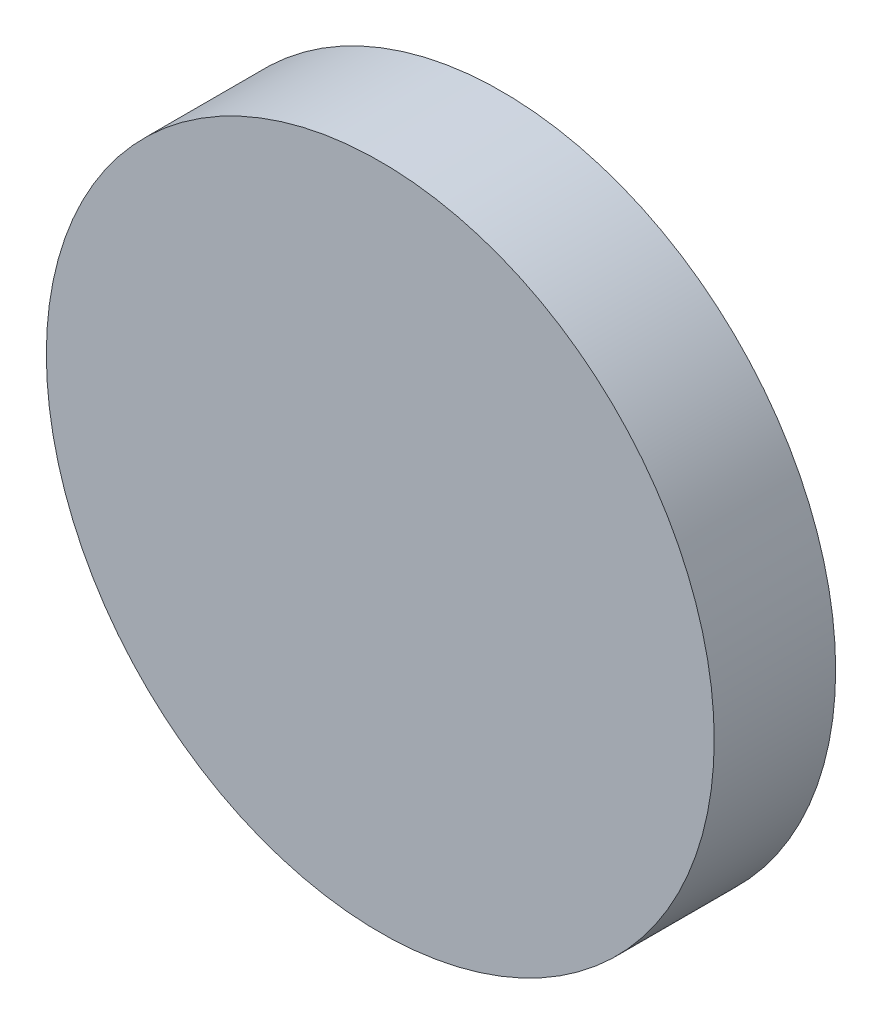
ISO-10303-21;
HEADER;
FILE_DESCRIPTION(('STEP AP214'),'2;1');
FILE_NAME('part.step','',(''),(''),'','','');
FILE_SCHEMA(('AUTOMOTIVE_DESIGN { 1 0 10303 214 1 1 1 1 }'));
ENDSEC;
DATA;
#1=APPLICATION_CONTEXT('core data for automotive mechanical design processes');
#2=APPLICATION_PROTOCOL_DEFINITION('international standard','automotive_design',2000,#1);
#3=PRODUCT_CONTEXT('',#1,'mechanical');
#4=PRODUCT('Part','Part','',(#3));
#5=PRODUCT_RELATED_PRODUCT_CATEGORY('part','',(#4));
#6=PRODUCT_DEFINITION_FORMATION('','',#4);
#7=PRODUCT_DEFINITION_CONTEXT('part definition',#1,'design');
#8=PRODUCT_DEFINITION('design','',#6,#7);
#9=PRODUCT_DEFINITION_SHAPE('','',#8);
#10=(LENGTH_UNIT() NAMED_UNIT(*) SI_UNIT(.MILLI.,.METRE.));
#11=(NAMED_UNIT(*) PLANE_ANGLE_UNIT() SI_UNIT($,.RADIAN.));
#12=(NAMED_UNIT(*) SI_UNIT($,.STERADIAN.) SOLID_ANGLE_UNIT());
#13=UNCERTAINTY_MEASURE_WITH_UNIT(LENGTH_MEASURE(1.E-05),#10,'distance_accuracy_value','');
#14=(GEOMETRIC_REPRESENTATION_CONTEXT(3) GLOBAL_UNCERTAINTY_ASSIGNED_CONTEXT((#13)) GLOBAL_UNIT_ASSIGNED_CONTEXT((#10,
#11,#12)) REPRESENTATION_CONTEXT('',''));
#15=CARTESIAN_POINT('',(0.,0.,0.));
#16=DIRECTION('',(0.,0.,1.));
#17=DIRECTION('',(1.,0.,0.));
#18=AXIS2_PLACEMENT_3D('',#15,#16,#17);
#19=CARTESIAN_POINT('',(0.,0.,76.2));
#20=DIRECTION('',(0.,0.,-1.));
#21=DIRECTION('',(-1.,0.,0.));
#22=AXIS2_PLACEMENT_3D('',#19,#20,#21);
#23=CYLINDRICAL_SURFACE('',#22,209.55);
#24=CARTESIAN_POINT('',(0.,0.,76.2));
#25=DIRECTION('',(0.,0.,1.));
#26=DIRECTION('',(1.,0.,0.));
#27=AXIS2_PLACEMENT_3D('',#24,#25,#26);
#28=CIRCLE('',#27,209.55);
#29=CARTESIAN_POINT('',(-209.55,0.,76.2));
#30=VERTEX_POINT('',#29);
#31=EDGE_CURVE('E10',#30,#30,#28,.T.);
#32=CARTESIAN_POINT('',(0.,0.,0.));
#33=DIRECTION('',(0.,0.,1.));
#34=DIRECTION('',(1.,0.,0.));
#35=AXIS2_PLACEMENT_3D('',#32,#33,#34);
#36=CIRCLE('',#35,209.55);
#37=CARTESIAN_POINT('',(-209.55,0.,0.));
#38=VERTEX_POINT('',#37);
#39=EDGE_CURVE('E34',#38,#38,#36,.T.);
#40=CARTESIAN_POINT('',(-209.55,0.,76.2));
#41=CARTESIAN_POINT('',(-209.55,0.,75.40625));
#42=CARTESIAN_POINT('',(-209.55,0.,74.6125));
#43=CARTESIAN_POINT('',(-209.55,0.,73.025));
#44=CARTESIAN_POINT('',(-209.55,0.,72.23125));
#45=CARTESIAN_POINT('',(-209.55,0.,70.64375));
#46=CARTESIAN_POINT('',(-209.55,0.,69.85));
#47=CARTESIAN_POINT('',(-209.55,0.,68.2625));
#48=CARTESIAN_POINT('',(-209.55,0.,67.46875));
#49=CARTESIAN_POINT('',(-209.55,0.,65.88125));
#50=CARTESIAN_POINT('',(-209.55,0.,65.0875));
#51=CARTESIAN_POINT('',(-209.55,0.,63.5));
#52=CARTESIAN_POINT('',(-209.55,0.,62.70625));
#53=CARTESIAN_POINT('',(-209.55,0.,61.11875));
#54=CARTESIAN_POINT('',(-209.55,0.,60.325));
#55=CARTESIAN_POINT('',(-209.55,0.,58.7375));
#56=CARTESIAN_POINT('',(-209.55,0.,57.94375));
#57=CARTESIAN_POINT('',(-209.55,0.,56.35625));
#58=CARTESIAN_POINT('',(-209.55,0.,55.5625));
#59=CARTESIAN_POINT('',(-209.55,0.,53.975));
#60=CARTESIAN_POINT('',(-209.55,0.,53.18125));
#61=CARTESIAN_POINT('',(-209.55,0.,51.59375));
#62=CARTESIAN_POINT('',(-209.55,0.,50.8));
#63=CARTESIAN_POINT('',(-209.55,0.,49.2125));
#64=CARTESIAN_POINT('',(-209.55,0.,48.41875));
#65=CARTESIAN_POINT('',(-209.55,0.,46.83125));
#66=CARTESIAN_POINT('',(-209.55,0.,46.0375));
#67=CARTESIAN_POINT('',(-209.55,0.,44.45));
#68=CARTESIAN_POINT('',(-209.55,0.,43.65625));
#69=CARTESIAN_POINT('',(-209.55,0.,42.06875));
#70=CARTESIAN_POINT('',(-209.55,0.,41.275));
#71=CARTESIAN_POINT('',(-209.55,0.,39.6875));
#72=CARTESIAN_POINT('',(-209.55,0.,38.89375));
#73=CARTESIAN_POINT('',(-209.55,0.,37.30625));
#74=CARTESIAN_POINT('',(-209.55,0.,36.5125));
#75=CARTESIAN_POINT('',(-209.55,0.,34.925));
#76=CARTESIAN_POINT('',(-209.55,0.,34.13125));
#77=CARTESIAN_POINT('',(-209.55,0.,32.54375));
#78=CARTESIAN_POINT('',(-209.55,0.,31.75));
#79=CARTESIAN_POINT('',(-209.55,0.,30.1625));
#80=CARTESIAN_POINT('',(-209.55,0.,29.36875));
#81=CARTESIAN_POINT('',(-209.55,0.,27.78125));
#82=CARTESIAN_POINT('',(-209.55,0.,26.9875));
#83=CARTESIAN_POINT('',(-209.55,0.,25.4));
#84=CARTESIAN_POINT('',(-209.55,0.,24.60625));
#85=CARTESIAN_POINT('',(-209.55,0.,23.01875));
#86=CARTESIAN_POINT('',(-209.55,0.,22.225));
#87=CARTESIAN_POINT('',(-209.55,0.,20.6375));
#88=CARTESIAN_POINT('',(-209.55,0.,19.84375));
#89=CARTESIAN_POINT('',(-209.55,0.,18.25625));
#90=CARTESIAN_POINT('',(-209.55,0.,17.4625));
#91=CARTESIAN_POINT('',(-209.55,0.,15.875));
#92=CARTESIAN_POINT('',(-209.55,0.,15.08125));
#93=CARTESIAN_POINT('',(-209.55,0.,13.49375));
#94=CARTESIAN_POINT('',(-209.55,0.,12.7));
#95=CARTESIAN_POINT('',(-209.55,0.,11.1125));
#96=CARTESIAN_POINT('',(-209.55,0.,10.31875));
#97=CARTESIAN_POINT('',(-209.55,0.,8.73125));
#98=CARTESIAN_POINT('',(-209.55,0.,7.93750000000001));
#99=CARTESIAN_POINT('',(-209.55,0.,6.35));
#100=CARTESIAN_POINT('',(-209.55,0.,5.55625));
#101=CARTESIAN_POINT('',(-209.55,0.,3.96875));
#102=CARTESIAN_POINT('',(-209.55,0.,3.175));
#103=CARTESIAN_POINT('',(-209.55,0.,1.5875));
#104=CARTESIAN_POINT('',(-209.55,0.,0.793750000000001));
#105=CARTESIAN_POINT('',(-209.55,0.,0.));
#106=B_SPLINE_CURVE_WITH_KNOTS('',3,(#40,#41,#42,#43,#44,#45,#46,#47,#48,#49,#50,#51,#52,#53,
#54,#55,#56,#57,#58,#59,#60,#61,#62,#63,#64,#65,#66,#67,#68,#69,#70,#71,#72,#73,#74,#75,#76,#77,
#78,#79,#80,#81,#82,#83,#84,#85,#86,#87,#88,#89,#90,#91,#92,#93,#94,#95,#96,#97,#98,#99,#100,
#101,#102,#103,#104,#105),.UNSPECIFIED.,.F.,.F.,(4,2,2,2,2,2,2,2,2,2,2,2,2,2,2,2,2,2,2,2,2,2,2,
2,2,2,2,2,2,2,2,2,4),(0.,2.38124999999999,4.76249999999999,7.14374999999999,9.52499999999999,
11.90625,14.2875,16.66875,19.05,21.43125,23.8125,26.19375,28.575,30.95625,33.3375,35.71875,38.1,
40.48125,42.8625,45.24375,47.625,50.00625,52.3875,54.76875,57.15,59.53125,61.9125,64.29375,
66.675,69.05625,71.4375,73.81875,76.2),.UNSPECIFIED.);
#107=EDGE_CURVE('BSEAM31',#30,#38,#106,.T.);
#108=ORIENTED_EDGE('',*,*,#31,.F.);
#109=ORIENTED_EDGE('',*,*,#39,.T.);
#110=ORIENTED_EDGE('',*,*,#107,.T.);
#111=ORIENTED_EDGE('',*,*,#107,.F.);
#112=EDGE_LOOP('',(#108,#110,#109,#111));
#113=FACE_BOUND('',#112,.T.);
#114=ADVANCED_FACE('F31',(#113),#23,.T.);
#115=CARTESIAN_POINT('',(0.,0.,76.2));
#116=DIRECTION('',(0.,0.,1.));
#117=DIRECTION('',(1.,0.,0.));
#118=AXIS2_PLACEMENT_3D('',#115,#116,#117);
#119=PLANE('',#118);
#120=ORIENTED_EDGE('',*,*,#31,.T.);
#121=EDGE_LOOP('',(#120));
#122=FACE_BOUND('',#121,.T.);
#123=ADVANCED_FACE('F46',(#122),#119,.T.);
#124=CARTESIAN_POINT('',(0.,0.,0.));
#125=DIRECTION('',(0.,0.,1.));
#126=DIRECTION('',(1.,0.,0.));
#127=AXIS2_PLACEMENT_3D('',#124,#125,#126);
#128=PLANE('',#127);
#129=ORIENTED_EDGE('',*,*,#39,.F.);
#130=EDGE_LOOP('',(#129));
#131=FACE_BOUND('',#130,.T.);
#132=ADVANCED_FACE('F44',(#131),#128,.F.);
#133=CLOSED_SHELL('',(#114,#123,#132));
#134=MANIFOLD_SOLID_BREP('B2',#133);
#135=ADVANCED_BREP_SHAPE_REPRESENTATION('',(#18,#134),#14);
#136=SHAPE_DEFINITION_REPRESENTATION(#9,#135);
ENDSEC;
END-ISO-10303-21;
